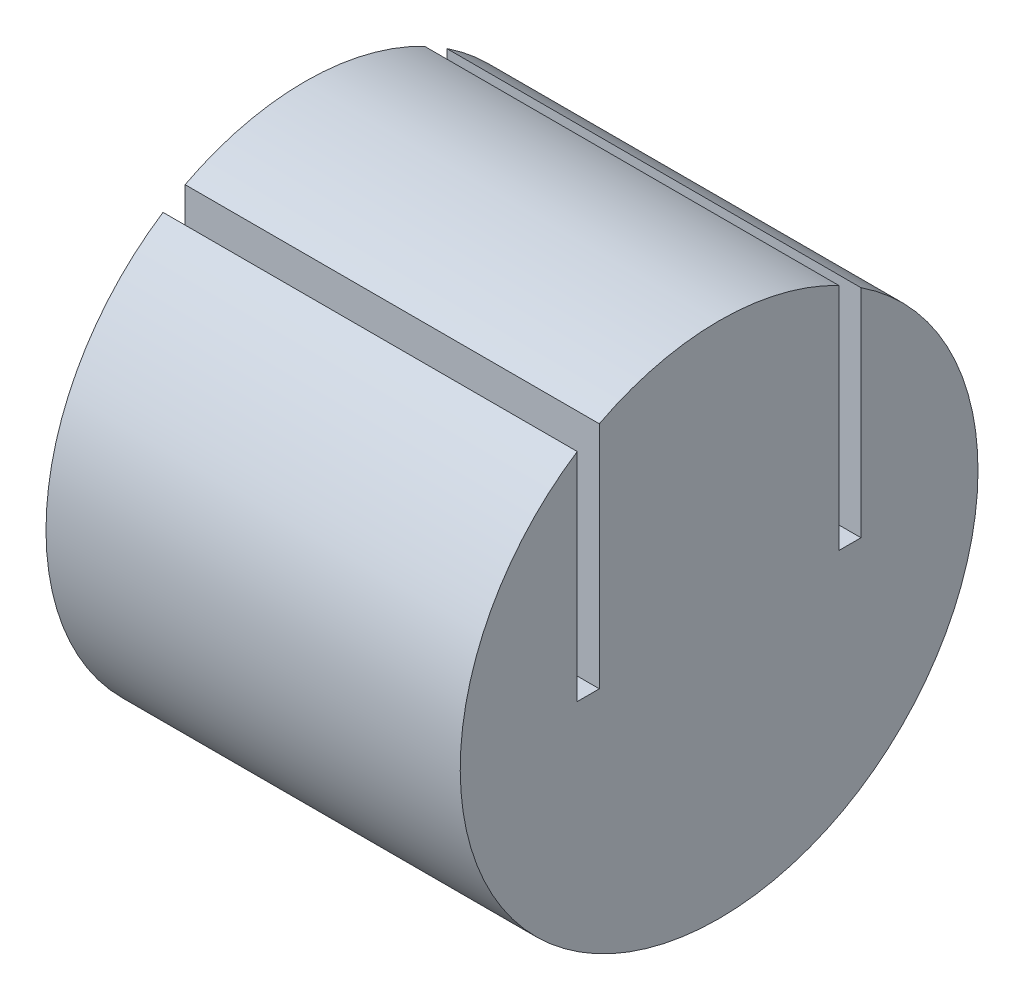
ISO-10303-21;
HEADER;
FILE_DESCRIPTION(('STEP AP214'),'2;1');
FILE_NAME('part.step','',(''),(''),'','','');
FILE_SCHEMA(('AUTOMOTIVE_DESIGN { 1 0 10303 214 1 1 1 1 }'));
ENDSEC;
DATA;
#1=APPLICATION_CONTEXT('core data for automotive mechanical design processes');
#2=APPLICATION_PROTOCOL_DEFINITION('international standard','automotive_design',2000,#1);
#3=PRODUCT_CONTEXT('',#1,'mechanical');
#4=PRODUCT('Part','Part','',(#3));
#5=PRODUCT_RELATED_PRODUCT_CATEGORY('part','',(#4));
#6=PRODUCT_DEFINITION_FORMATION('','',#4);
#7=PRODUCT_DEFINITION_CONTEXT('part definition',#1,'design');
#8=PRODUCT_DEFINITION('design','',#6,#7);
#9=PRODUCT_DEFINITION_SHAPE('','',#8);
#10=(LENGTH_UNIT() NAMED_UNIT(*) SI_UNIT(.MILLI.,.METRE.));
#11=(NAMED_UNIT(*) PLANE_ANGLE_UNIT() SI_UNIT($,.RADIAN.));
#12=(NAMED_UNIT(*) SI_UNIT($,.STERADIAN.) SOLID_ANGLE_UNIT());
#13=UNCERTAINTY_MEASURE_WITH_UNIT(LENGTH_MEASURE(1.E-05),#10,'distance_accuracy_value','');
#14=(GEOMETRIC_REPRESENTATION_CONTEXT(3) GLOBAL_UNCERTAINTY_ASSIGNED_CONTEXT((#13)) GLOBAL_UNIT_ASSIGNED_CONTEXT((#10,
#11,#12)) REPRESENTATION_CONTEXT('',''));
#15=CARTESIAN_POINT('',(0.,0.,0.));
#16=DIRECTION('',(0.,0.,1.));
#17=DIRECTION('',(1.,0.,0.));
#18=AXIS2_PLACEMENT_3D('',#15,#16,#17);
#19=CARTESIAN_POINT('',(15.24,0.,4.4069));
#20=DIRECTION('',(0.,0.,-1.));
#21=DIRECTION('',(0.,1.,0.));
#22=AXIS2_PLACEMENT_3D('',#19,#20,#21);
#23=PLANE('',#22);
#24=DIRECTION('',(0.,-1.,0.));
#25=VECTOR('',#24,1.);
#26=CARTESIAN_POINT('',(0.,0.,4.4069));
#27=LINE('',#26,#25);
#28=CARTESIAN_POINT('',(0.,8.44422035418309,4.4069));
#29=VERTEX_POINT('',#28);
#30=CARTESIAN_POINT('',(0.,0.,4.4069));
#31=VERTEX_POINT('',#30);
#32=EDGE_CURVE('E181',#29,#31,#27,.T.);
#33=ORIENTED_EDGE('',*,*,#32,.T.);
#34=DIRECTION('',(-1.,0.,0.));
#35=VECTOR('',#34,1.);
#36=CARTESIAN_POINT('',(15.24,0.,4.4069));
#37=LINE('',#36,#35);
#38=CARTESIAN_POINT('',(15.24,0.,4.4069));
#39=VERTEX_POINT('',#38);
#40=EDGE_CURVE('E11',#39,#31,#37,.T.);
#41=ORIENTED_EDGE('',*,*,#40,.F.);
#42=DIRECTION('',(0.,-1.,0.));
#43=VECTOR('',#42,1.);
#44=CARTESIAN_POINT('',(15.24,0.,4.4069));
#45=LINE('',#44,#43);
#46=CARTESIAN_POINT('',(15.24,8.44422035418309,4.4069));
#47=VERTEX_POINT('',#46);
#48=EDGE_CURVE('E97',#47,#39,#45,.T.);
#49=ORIENTED_EDGE('',*,*,#48,.F.);
#50=DIRECTION('',(-1.,0.,0.));
#51=VECTOR('',#50,1.);
#52=CARTESIAN_POINT('',(15.24,8.44422035418309,4.4069));
#53=LINE('',#52,#51);
#54=EDGE_CURVE('E154',#47,#29,#53,.T.);
#55=ORIENTED_EDGE('',*,*,#54,.T.);
#56=EDGE_LOOP('',(#33,#41,#49,#55));
#57=FACE_BOUND('',#56,.T.);
#58=ADVANCED_FACE('F41',(#57),#23,.F.);
#59=CARTESIAN_POINT('',(15.24,0.,0.));
#60=DIRECTION('',(0.,1.,0.));
#61=DIRECTION('',(0.,0.,1.));
#62=AXIS2_PLACEMENT_3D('',#59,#60,#61);
#63=PLANE('',#62);
#64=DIRECTION('',(0.,0.,-1.));
#65=VECTOR('',#64,1.);
#66=CARTESIAN_POINT('',(0.,0.,0.));
#67=LINE('',#66,#65);
#68=CARTESIAN_POINT('',(0.,0.,5.2197));
#69=VERTEX_POINT('',#68);
#70=EDGE_CURVE('E175',#69,#31,#67,.T.);
#71=ORIENTED_EDGE('',*,*,#70,.F.);
#72=DIRECTION('',(-1.,0.,0.));
#73=VECTOR('',#72,1.);
#74=CARTESIAN_POINT('',(15.24,0.,5.2197));
#75=LINE('',#74,#73);
#76=CARTESIAN_POINT('',(15.24,0.,5.2197));
#77=VERTEX_POINT('',#76);
#78=EDGE_CURVE('E50',#77,#69,#75,.T.);
#79=ORIENTED_EDGE('',*,*,#78,.F.);
#80=DIRECTION('',(0.,0.,-1.));
#81=VECTOR('',#80,1.);
#82=CARTESIAN_POINT('',(15.24,0.,0.));
#83=LINE('',#82,#81);
#84=EDGE_CURVE('E135',#77,#39,#83,.T.);
#85=ORIENTED_EDGE('',*,*,#84,.T.);
#86=ORIENTED_EDGE('',*,*,#40,.T.);
#87=EDGE_LOOP('',(#71,#79,#85,#86));
#88=FACE_BOUND('',#87,.T.);
#89=ADVANCED_FACE('F176',(#88),#63,.T.);
#90=CARTESIAN_POINT('',(15.24,0.,5.2197));
#91=DIRECTION('',(0.,0.,-1.));
#92=DIRECTION('',(0.,1.,0.));
#93=AXIS2_PLACEMENT_3D('',#90,#91,#92);
#94=PLANE('',#93);
#95=DIRECTION('',(0.,-1.,0.));
#96=VECTOR('',#95,1.);
#97=CARTESIAN_POINT('',(0.,0.,5.2197));
#98=LINE('',#97,#96);
#99=CARTESIAN_POINT('',(0.,7.96745611283802,5.2197));
#100=VERTEX_POINT('',#99);
#101=EDGE_CURVE('E172',#100,#69,#98,.T.);
#102=ORIENTED_EDGE('',*,*,#101,.F.);
#103=DIRECTION('',(-1.,0.,0.));
#104=VECTOR('',#103,1.);
#105=CARTESIAN_POINT('',(15.24,7.96745611283802,5.2197));
#106=LINE('',#105,#104);
#107=CARTESIAN_POINT('',(15.24,7.96745611283802,5.2197));
#108=VERTEX_POINT('',#107);
#109=EDGE_CURVE('E164',#108,#100,#106,.T.);
#110=ORIENTED_EDGE('',*,*,#109,.F.);
#111=DIRECTION('',(0.,-1.,0.));
#112=VECTOR('',#111,1.);
#113=CARTESIAN_POINT('',(15.24,0.,5.2197));
#114=LINE('',#113,#112);
#115=EDGE_CURVE('E143',#108,#77,#114,.T.);
#116=ORIENTED_EDGE('',*,*,#115,.T.);
#117=ORIENTED_EDGE('',*,*,#78,.T.);
#118=EDGE_LOOP('',(#102,#110,#116,#117));
#119=FACE_BOUND('',#118,.T.);
#120=ADVANCED_FACE('F170',(#119),#94,.T.);
#121=CARTESIAN_POINT('',(15.24,0.,0.));
#122=DIRECTION('',(-1.,0.,0.));
#123=DIRECTION('',(0.,0.,1.));
#124=AXIS2_PLACEMENT_3D('',#121,#122,#123);
#125=CYLINDRICAL_SURFACE('',#124,9.525);
#126=CARTESIAN_POINT('',(0.,0.,0.));
#127=DIRECTION('',(1.,0.,0.));
#128=DIRECTION('',(0.,0.,-1.));
#129=AXIS2_PLACEMENT_3D('',#126,#127,#128);
#130=CIRCLE('',#129,9.525);
#131=CARTESIAN_POINT('',(0.,7.96745611283802,-5.2197));
#132=VERTEX_POINT('',#131);
#133=EDGE_CURVE('E187',#100,#132,#130,.T.);
#134=ORIENTED_EDGE('',*,*,#133,.T.);
#135=DIRECTION('',(-1.,0.,0.));
#136=VECTOR('',#135,1.);
#137=CARTESIAN_POINT('',(15.24,7.96745611283802,-5.2197));
#138=LINE('',#137,#136);
#139=CARTESIAN_POINT('',(15.24,7.96745611283802,-5.2197));
#140=VERTEX_POINT('',#139);
#141=EDGE_CURVE('E161',#140,#132,#138,.T.);
#142=ORIENTED_EDGE('',*,*,#141,.F.);
#143=CARTESIAN_POINT('',(15.24,0.,0.));
#144=DIRECTION('',(1.,0.,0.));
#145=DIRECTION('',(0.,0.,-1.));
#146=AXIS2_PLACEMENT_3D('',#143,#144,#145);
#147=CIRCLE('',#146,9.525);
#148=EDGE_CURVE('E137',#108,#140,#147,.T.);
#149=ORIENTED_EDGE('',*,*,#148,.F.);
#150=ORIENTED_EDGE('',*,*,#109,.T.);
#151=EDGE_LOOP('',(#134,#142,#149,#150));
#152=FACE_BOUND('',#151,.T.);
#153=ADVANCED_FACE('F206',(#152),#125,.T.);
#154=CARTESIAN_POINT('',(15.24,0.,-5.2197));
#155=DIRECTION('',(0.,0.,1.));
#156=DIRECTION('',(1.,0.,0.));
#157=AXIS2_PLACEMENT_3D('',#154,#155,#156);
#158=PLANE('',#157);
#159=DIRECTION('',(0.,1.,0.));
#160=VECTOR('',#159,1.);
#161=CARTESIAN_POINT('',(0.,0.,-5.2197));
#162=LINE('',#161,#160);
#163=CARTESIAN_POINT('',(0.,0.,-5.2197));
#164=VERTEX_POINT('',#163);
#165=EDGE_CURVE('E191',#164,#132,#162,.T.);
#166=ORIENTED_EDGE('',*,*,#165,.F.);
#167=DIRECTION('',(-1.,0.,0.));
#168=VECTOR('',#167,1.);
#169=CARTESIAN_POINT('',(15.24,0.,-5.2197));
#170=LINE('',#169,#168);
#171=CARTESIAN_POINT('',(15.24,0.,-5.2197));
#172=VERTEX_POINT('',#171);
#173=EDGE_CURVE('E122',#172,#164,#170,.T.);
#174=ORIENTED_EDGE('',*,*,#173,.F.);
#175=DIRECTION('',(0.,1.,0.));
#176=VECTOR('',#175,1.);
#177=CARTESIAN_POINT('',(15.24,0.,-5.2197));
#178=LINE('',#177,#176);
#179=EDGE_CURVE('E132',#172,#140,#178,.T.);
#180=ORIENTED_EDGE('',*,*,#179,.T.);
#181=ORIENTED_EDGE('',*,*,#141,.T.);
#182=EDGE_LOOP('',(#166,#174,#180,#181));
#183=FACE_BOUND('',#182,.T.);
#184=ADVANCED_FACE('F208',(#183),#158,.T.);
#185=CARTESIAN_POINT('',(0.,0.,-4.4069));
#186=VERTEX_POINT('',#185);
#187=EDGE_CURVE('E120',#186,#164,#67,.T.);
#188=ORIENTED_EDGE('',*,*,#187,.F.);
#189=DIRECTION('',(-1.,0.,0.));
#190=VECTOR('',#189,1.);
#191=CARTESIAN_POINT('',(15.24,0.,-4.4069));
#192=LINE('',#191,#190);
#193=CARTESIAN_POINT('',(15.24,0.,-4.4069));
#194=VERTEX_POINT('',#193);
#195=EDGE_CURVE('E114',#194,#186,#192,.T.);
#196=ORIENTED_EDGE('',*,*,#195,.F.);
#197=EDGE_CURVE('E118',#194,#172,#83,.T.);
#198=ORIENTED_EDGE('',*,*,#197,.T.);
#199=ORIENTED_EDGE('',*,*,#173,.T.);
#200=EDGE_LOOP('',(#188,#196,#198,#199));
#201=FACE_BOUND('',#200,.T.);
#202=ADVANCED_FACE('F116',(#201),#63,.T.);
#203=CARTESIAN_POINT('',(15.24,0.,-4.4069));
#204=DIRECTION('',(0.,0.,1.));
#205=DIRECTION('',(1.,0.,0.));
#206=AXIS2_PLACEMENT_3D('',#203,#204,#205);
#207=PLANE('',#206);
#208=DIRECTION('',(0.,1.,0.));
#209=VECTOR('',#208,1.);
#210=CARTESIAN_POINT('',(0.,0.,-4.4069));
#211=LINE('',#210,#209);
#212=CARTESIAN_POINT('',(0.,8.44422035418309,-4.4069));
#213=VERTEX_POINT('',#212);
#214=EDGE_CURVE('E85',#186,#213,#211,.T.);
#215=ORIENTED_EDGE('',*,*,#214,.T.);
#216=DIRECTION('',(-1.,0.,0.));
#217=VECTOR('',#216,1.);
#218=CARTESIAN_POINT('',(15.24,8.44422035418309,-4.4069));
#219=LINE('',#218,#217);
#220=CARTESIAN_POINT('',(15.24,8.44422035418309,-4.4069));
#221=VERTEX_POINT('',#220);
#222=EDGE_CURVE('E123',#221,#213,#219,.T.);
#223=ORIENTED_EDGE('',*,*,#222,.F.);
#224=DIRECTION('',(0.,1.,0.));
#225=VECTOR('',#224,1.);
#226=CARTESIAN_POINT('',(15.24,0.,-4.4069));
#227=LINE('',#226,#225);
#228=EDGE_CURVE('E125',#194,#221,#227,.T.);
#229=ORIENTED_EDGE('',*,*,#228,.F.);
#230=ORIENTED_EDGE('',*,*,#195,.T.);
#231=EDGE_LOOP('',(#215,#223,#229,#230));
#232=FACE_BOUND('',#231,.T.);
#233=ADVANCED_FACE('F126',(#232),#207,.F.);
#234=CARTESIAN_POINT('',(15.24,0.,0.));
#235=DIRECTION('',(-1.,0.,0.));
#236=DIRECTION('',(0.,0.,1.));
#237=AXIS2_PLACEMENT_3D('',#234,#235,#236);
#238=CYLINDRICAL_SURFACE('',#237,9.525);
#239=CARTESIAN_POINT('',(0.,0.,0.));
#240=DIRECTION('',(1.,0.,0.));
#241=DIRECTION('',(0.,0.,-1.));
#242=AXIS2_PLACEMENT_3D('',#239,#240,#241);
#243=CIRCLE('',#242,9.525);
#244=EDGE_CURVE('E91',#213,#29,#243,.T.);
#245=ORIENTED_EDGE('',*,*,#244,.T.);
#246=ORIENTED_EDGE('',*,*,#54,.F.);
#247=CARTESIAN_POINT('',(15.24,0.,0.));
#248=DIRECTION('',(1.,0.,0.));
#249=DIRECTION('',(0.,0.,-1.));
#250=AXIS2_PLACEMENT_3D('',#247,#248,#249);
#251=CIRCLE('',#250,9.525);
#252=EDGE_CURVE('E58',#221,#47,#251,.T.);
#253=ORIENTED_EDGE('',*,*,#252,.F.);
#254=ORIENTED_EDGE('',*,*,#222,.T.);
#255=EDGE_LOOP('',(#245,#246,#253,#254));
#256=FACE_BOUND('',#255,.T.);
#257=ADVANCED_FACE('F227',(#256),#238,.T.);
#258=CARTESIAN_POINT('',(15.24,0.,0.));
#259=DIRECTION('',(1.,0.,0.));
#260=DIRECTION('',(0.,0.,-1.));
#261=AXIS2_PLACEMENT_3D('',#258,#259,#260);
#262=PLANE('',#261);
#263=ORIENTED_EDGE('',*,*,#48,.T.);
#264=ORIENTED_EDGE('',*,*,#84,.F.);
#265=ORIENTED_EDGE('',*,*,#115,.F.);
#266=ORIENTED_EDGE('',*,*,#148,.T.);
#267=ORIENTED_EDGE('',*,*,#179,.F.);
#268=ORIENTED_EDGE('',*,*,#197,.F.);
#269=ORIENTED_EDGE('',*,*,#228,.T.);
#270=ORIENTED_EDGE('',*,*,#252,.T.);
#271=EDGE_LOOP('',(#263,#264,#265,#266,#267,#268,#269,#270));
#272=FACE_BOUND('',#271,.T.);
#273=ADVANCED_FACE('F130',(#272),#262,.T.);
#274=CARTESIAN_POINT('',(0.,0.,0.));
#275=DIRECTION('',(1.,0.,0.));
#276=DIRECTION('',(0.,0.,-1.));
#277=AXIS2_PLACEMENT_3D('',#274,#275,#276);
#278=PLANE('',#277);
#279=ORIENTED_EDGE('',*,*,#32,.F.);
#280=ORIENTED_EDGE('',*,*,#244,.F.);
#281=ORIENTED_EDGE('',*,*,#214,.F.);
#282=ORIENTED_EDGE('',*,*,#187,.T.);
#283=ORIENTED_EDGE('',*,*,#165,.T.);
#284=ORIENTED_EDGE('',*,*,#133,.F.);
#285=ORIENTED_EDGE('',*,*,#101,.T.);
#286=ORIENTED_EDGE('',*,*,#70,.T.);
#287=EDGE_LOOP('',(#279,#280,#281,#282,#283,#284,#285,#286));
#288=FACE_BOUND('',#287,.T.);
#289=ADVANCED_FACE('F184',(#288),#278,.F.);
#290=CLOSED_SHELL('',(#58,#89,#120,#153,#184,#202,#233,#257,#273,#289));
#291=MANIFOLD_SOLID_BREP('B2',#290);
#292=ADVANCED_BREP_SHAPE_REPRESENTATION('',(#18,#291),#14);
#293=SHAPE_DEFINITION_REPRESENTATION(#9,#292);
ENDSEC;
END-ISO-10303-21;
